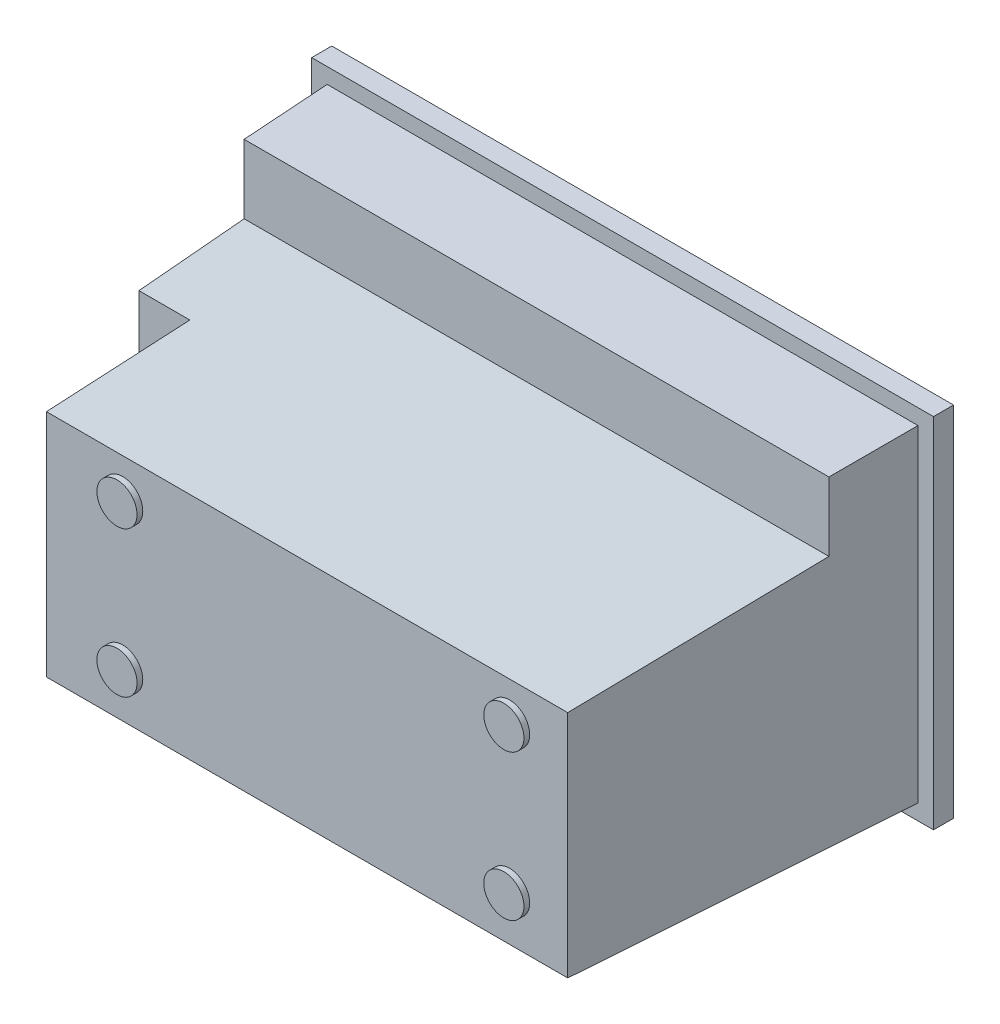
ISO-10303-21;
HEADER;
FILE_DESCRIPTION(('STEP AP214'),'2;1');
FILE_NAME('part.step','',(''),(''),'','','');
FILE_SCHEMA(('AUTOMOTIVE_DESIGN { 1 0 10303 214 1 1 1 1 }'));
ENDSEC;
DATA;
#1=APPLICATION_CONTEXT('core data for automotive mechanical design processes');
#2=APPLICATION_PROTOCOL_DEFINITION('international standard','automotive_design',2000,#1);
#3=PRODUCT_CONTEXT('',#1,'mechanical');
#4=PRODUCT('Part','Part','',(#3));
#5=PRODUCT_RELATED_PRODUCT_CATEGORY('part','',(#4));
#6=PRODUCT_DEFINITION_FORMATION('','',#4);
#7=PRODUCT_DEFINITION_CONTEXT('part definition',#1,'design');
#8=PRODUCT_DEFINITION('design','',#6,#7);
#9=PRODUCT_DEFINITION_SHAPE('','',#8);
#10=(LENGTH_UNIT() NAMED_UNIT(*) SI_UNIT(.MILLI.,.METRE.));
#11=(NAMED_UNIT(*) PLANE_ANGLE_UNIT() SI_UNIT($,.RADIAN.));
#12=(NAMED_UNIT(*) SI_UNIT($,.STERADIAN.) SOLID_ANGLE_UNIT());
#13=UNCERTAINTY_MEASURE_WITH_UNIT(LENGTH_MEASURE(1.E-05),#10,'distance_accuracy_value','');
#14=(GEOMETRIC_REPRESENTATION_CONTEXT(3) GLOBAL_UNCERTAINTY_ASSIGNED_CONTEXT((#13)) GLOBAL_UNIT_ASSIGNED_CONTEXT((#10,
#11,#12)) REPRESENTATION_CONTEXT('',''));
#15=CARTESIAN_POINT('',(0.,0.,0.));
#16=DIRECTION('',(0.,0.,1.));
#17=DIRECTION('',(1.,0.,0.));
#18=AXIS2_PLACEMENT_3D('',#15,#16,#17);
#19=CARTESIAN_POINT('',(-51.5,-28.5,59.));
#20=DIRECTION('',(0.,0.,1.));
#21=DIRECTION('',(1.,0.,0.));
#22=AXIS2_PLACEMENT_3D('',#19,#20,#21);
#23=PLANE('',#22);
#24=DIRECTION('',(1.,0.,0.));
#25=VECTOR('',#24,1.);
#26=CARTESIAN_POINT('',(-54.2,13.626611521418,59.));
#27=LINE('',#26,#25);
#28=CARTESIAN_POINT('',(-41.4396745999869,13.626611521418,59.));
#29=VERTEX_POINT('',#28);
#30=CARTESIAN_POINT('',(49.4396745999869,13.626611521418,59.));
#31=VERTEX_POINT('',#30);
#32=EDGE_CURVE('E179',#29,#31,#27,.T.);
#33=ORIENTED_EDGE('',*,*,#32,.F.);
#34=DIRECTION('',(0.,1.,0.));
#35=VECTOR('',#34,1.);
#36=CARTESIAN_POINT('',(-41.4396745999869,-28.5,59.));
#37=LINE('',#36,#35);
#38=CARTESIAN_POINT('',(-41.4396745999869,-26.4396745999869,59.));
#39=VERTEX_POINT('',#38);
#40=EDGE_CURVE('E279',#39,#29,#37,.T.);
#41=ORIENTED_EDGE('',*,*,#40,.F.);
#42=DIRECTION('',(-1.,0.,0.));
#43=VECTOR('',#42,1.);
#44=CARTESIAN_POINT('',(-51.5,-26.4396745999869,59.));
#45=LINE('',#44,#43);
#46=CARTESIAN_POINT('',(49.4396745999869,-26.4396745999869,59.));
#47=VERTEX_POINT('',#46);
#48=EDGE_CURVE('E275',#39,#47,#45,.F.);
#49=ORIENTED_EDGE('',*,*,#48,.T.);
#50=DIRECTION('',(0.,-1.,0.));
#51=VECTOR('',#50,1.);
#52=CARTESIAN_POINT('',(49.4396745999869,28.5,59.));
#53=LINE('',#52,#51);
#54=EDGE_CURVE('E284',#47,#31,#53,.F.);
#55=ORIENTED_EDGE('',*,*,#54,.T.);
#56=EDGE_LOOP('',(#33,#41,#49,#55));
#57=FACE_BOUND('',#56,.T.);
#58=CARTESIAN_POINT('',(-28.1462333825702,-18.4433528325343,59.));
#59=DIRECTION('',(0.,0.,1.));
#60=DIRECTION('',(1.,0.,0.));
#61=AXIS2_PLACEMENT_3D('',#58,#59,#60);
#62=CIRCLE('',#61,3.5);
#63=CARTESIAN_POINT('',(-24.6462333825702,-18.4433528325343,59.));
#64=VERTEX_POINT('',#63);
#65=EDGE_CURVE('E235',#64,#64,#62,.T.);
#66=ORIENTED_EDGE('',*,*,#65,.F.);
#67=EDGE_LOOP('',(#66));
#68=FACE_BOUND('',#67,.T.);
#69=CARTESIAN_POINT('',(-28.1462333825702,6.97733127127265,59.));
#70=DIRECTION('',(0.,0.,1.));
#71=DIRECTION('',(1.,0.,0.));
#72=AXIS2_PLACEMENT_3D('',#69,#70,#71);
#73=CIRCLE('',#72,3.5);
#74=CARTESIAN_POINT('',(-24.6462333825702,6.97733127127265,59.));
#75=VERTEX_POINT('',#74);
#76=EDGE_CURVE('E247',#75,#75,#73,.T.);
#77=ORIENTED_EDGE('',*,*,#76,.F.);
#78=EDGE_LOOP('',(#77));
#79=FACE_BOUND('',#78,.T.);
#80=CARTESIAN_POINT('',(39.3032988675529,6.97733127127265,59.));
#81=DIRECTION('',(0.,0.,1.));
#82=DIRECTION('',(1.,0.,0.));
#83=AXIS2_PLACEMENT_3D('',#80,#81,#82);
#84=CIRCLE('',#83,3.5);
#85=CARTESIAN_POINT('',(42.8032988675529,6.97733127127265,59.));
#86=VERTEX_POINT('',#85);
#87=EDGE_CURVE('E241',#86,#86,#84,.T.);
#88=ORIENTED_EDGE('',*,*,#87,.F.);
#89=EDGE_LOOP('',(#88));
#90=FACE_BOUND('',#89,.T.);
#91=CARTESIAN_POINT('',(39.3032988675529,-18.4433528325343,59.));
#92=DIRECTION('',(0.,0.,1.));
#93=DIRECTION('',(1.,0.,0.));
#94=AXIS2_PLACEMENT_3D('',#91,#92,#93);
#95=CIRCLE('',#94,3.5);
#96=CARTESIAN_POINT('',(42.8032988675529,-18.4433528325343,59.));
#97=VERTEX_POINT('',#96);
#98=EDGE_CURVE('E229',#97,#97,#95,.T.);
#99=ORIENTED_EDGE('',*,*,#98,.F.);
#100=EDGE_LOOP('',(#99));
#101=FACE_BOUND('',#100,.T.);
#102=ADVANCED_FACE('F28',(#57,#68,#79,#90,#101),#23,.T.);
#103=CARTESIAN_POINT('',(-51.5,28.5,0.));
#104=DIRECTION('',(-0.999390827019096,0.,0.034899496702501));
#105=DIRECTION('',(0.0348994967025011,0.,0.999390827019096));
#106=AXIS2_PLACEMENT_3D('',#103,#104,#105);
#107=PLANE('',#106);
#108=DIRECTION('',(0.034849905182522,-0.0532911128909333,0.99797071169229));
#109=VECTOR('',#108,1.);
#110=CARTESIAN_POINT('',(-51.5217715056825,16.8104727305136,-0.623454351076155));
#111=LINE('',#110,#109);
#112=CARTESIAN_POINT('',(-50.3126938372806,14.9615984169895,34.));
#113=VERTEX_POINT('',#112);
#114=CARTESIAN_POINT('',(-50.9761884576238,15.9761884576238,15.));
#115=VERTEX_POINT('',#114);
#116=EDGE_CURVE('E187',#113,#115,#111,.F.);
#117=ORIENTED_EDGE('',*,*,#116,.T.);
#118=DIRECTION('',(0.,-1.,0.));
#119=VECTOR('',#118,1.);
#120=CARTESIAN_POINT('',(-50.9761884576238,28.5,15.));
#121=LINE('',#120,#119);
#122=CARTESIAN_POINT('',(-50.9761884576238,27.9761884576238,15.));
#123=VERTEX_POINT('',#122);
#124=EDGE_CURVE('E196',#115,#123,#121,.F.);
#125=ORIENTED_EDGE('',*,*,#124,.T.);
#126=DIRECTION('',(-0.0348782627423747,0.0348782627423747,-0.998782765958718));
#127=VECTOR('',#126,1.);
#128=CARTESIAN_POINT('',(-51.5,28.5,0.));
#129=LINE('',#128,#127);
#130=CARTESIAN_POINT('',(-51.5,28.5,0.));
#131=VERTEX_POINT('',#130);
#132=EDGE_CURVE('E281',#123,#131,#129,.T.);
#133=ORIENTED_EDGE('',*,*,#132,.T.);
#134=DIRECTION('',(0.,-1.,0.));
#135=VECTOR('',#134,1.);
#136=CARTESIAN_POINT('',(-51.5,28.5,0.));
#137=LINE('',#136,#135);
#138=CARTESIAN_POINT('',(-51.5,-28.5,0.));
#139=VERTEX_POINT('',#138);
#140=EDGE_CURVE('E263',#131,#139,#137,.T.);
#141=ORIENTED_EDGE('',*,*,#140,.T.);
#142=DIRECTION('',(-0.0348782627423747,-0.0348782627423747,-0.998782765958718));
#143=VECTOR('',#142,1.);
#144=CARTESIAN_POINT('',(-51.5,-28.5,0.));
#145=LINE('',#144,#143);
#146=CARTESIAN_POINT('',(-50.3126938372806,-27.3126938372806,34.));
#147=VERTEX_POINT('',#146);
#148=EDGE_CURVE('E276',#147,#139,#145,.T.);
#149=ORIENTED_EDGE('',*,*,#148,.F.);
#150=DIRECTION('',(0.,1.,0.));
#151=VECTOR('',#150,1.);
#152=CARTESIAN_POINT('',(-50.3126938372806,28.5,34.));
#153=LINE('',#152,#151);
#154=EDGE_CURVE('E259',#113,#147,#153,.F.);
#155=ORIENTED_EDGE('',*,*,#154,.F.);
#156=EDGE_LOOP('',(#117,#125,#133,#141,#149,#155));
#157=FACE_BOUND('',#156,.T.);
#158=ADVANCED_FACE('F305',(#157),#107,.T.);
#159=CARTESIAN_POINT('',(-51.5,-28.5,0.));
#160=DIRECTION('',(0.,-0.999390827019096,0.034899496702501));
#161=DIRECTION('',(0.,-0.034899496702501,-0.999390827019096));
#162=AXIS2_PLACEMENT_3D('',#159,#160,#161);
#163=PLANE('',#162);
#164=ORIENTED_EDGE('',*,*,#48,.F.);
#165=DIRECTION('',(0.,0.034899496702501,0.999390827019096));
#166=VECTOR('',#165,1.);
#167=CARTESIAN_POINT('',(-41.4396745999869,-28.5,0.));
#168=LINE('',#167,#166);
#169=CARTESIAN_POINT('',(-41.4396745999869,-27.3126938372806,34.));
#170=VERTEX_POINT('',#169);
#171=EDGE_CURVE('E256',#39,#170,#168,.F.);
#172=ORIENTED_EDGE('',*,*,#171,.T.);
#173=DIRECTION('',(-1.,0.,0.));
#174=VECTOR('',#173,1.);
#175=CARTESIAN_POINT('',(-51.5,-27.3126938372806,34.));
#176=LINE('',#175,#174);
#177=EDGE_CURVE('E261',#147,#170,#176,.F.);
#178=ORIENTED_EDGE('',*,*,#177,.F.);
#179=ORIENTED_EDGE('',*,*,#148,.T.);
#180=DIRECTION('',(1.,0.,0.));
#181=VECTOR('',#180,1.);
#182=CARTESIAN_POINT('',(-51.5,-28.5,0.));
#183=LINE('',#182,#181);
#184=CARTESIAN_POINT('',(51.5,-28.5,0.));
#185=VERTEX_POINT('',#184);
#186=EDGE_CURVE('E266',#139,#185,#183,.T.);
#187=ORIENTED_EDGE('',*,*,#186,.T.);
#188=DIRECTION('',(0.0348782627423747,-0.0348782627423747,-0.998782765958718));
#189=VECTOR('',#188,1.);
#190=CARTESIAN_POINT('',(51.4306598869202,-28.4306598869202,1.98564104081884));
#191=LINE('',#190,#189);
#192=EDGE_CURVE('E280',#47,#185,#191,.T.);
#193=ORIENTED_EDGE('',*,*,#192,.F.);
#194=EDGE_LOOP('',(#164,#172,#178,#179,#187,#193));
#195=FACE_BOUND('',#194,.T.);
#196=ADVANCED_FACE('F30',(#195),#163,.T.);
#197=CARTESIAN_POINT('',(51.5,28.5,0.));
#198=DIRECTION('',(0.999390827019096,0.,0.034899496702501));
#199=DIRECTION('',(0.0348994967025011,0.,-0.999390827019096));
#200=AXIS2_PLACEMENT_3D('',#197,#198,#199);
#201=PLANE('',#200);
#202=DIRECTION('',(0.0348782627423747,0.0348782627423747,-0.998782765958718));
#203=VECTOR('',#202,1.);
#204=CARTESIAN_POINT('',(51.3747011991716,28.3747011991716,3.58808819656738));
#205=LINE('',#204,#203);
#206=CARTESIAN_POINT('',(50.9761884576238,27.9761884576238,15.));
#207=VERTEX_POINT('',#206);
#208=CARTESIAN_POINT('',(51.5,28.5,0.));
#209=VERTEX_POINT('',#208);
#210=EDGE_CURVE('E283',#207,#209,#205,.T.);
#211=ORIENTED_EDGE('',*,*,#210,.F.);
#212=DIRECTION('',(0.,1.,0.));
#213=VECTOR('',#212,1.);
#214=CARTESIAN_POINT('',(50.9761884576238,28.5,15.));
#215=LINE('',#214,#213);
#216=CARTESIAN_POINT('',(50.9761884576238,15.9761884576238,15.));
#217=VERTEX_POINT('',#216);
#218=EDGE_CURVE('E193',#207,#217,#215,.F.);
#219=ORIENTED_EDGE('',*,*,#218,.T.);
#220=DIRECTION('',(0.0348499051825219,0.0532911128909333,-0.99797071169229));
#221=VECTOR('',#220,1.);
#222=CARTESIAN_POINT('',(51.5217715056826,16.8104727305136,-0.623454351076155));
#223=LINE('',#222,#221);
#224=EDGE_CURVE('E190',#217,#31,#223,.F.);
#225=ORIENTED_EDGE('',*,*,#224,.T.);
#226=ORIENTED_EDGE('',*,*,#54,.F.);
#227=ORIENTED_EDGE('',*,*,#192,.T.);
#228=DIRECTION('',(0.,1.,0.));
#229=VECTOR('',#228,1.);
#230=CARTESIAN_POINT('',(51.5,28.5,0.));
#231=LINE('',#230,#229);
#232=EDGE_CURVE('E269',#185,#209,#231,.T.);
#233=ORIENTED_EDGE('',*,*,#232,.T.);
#234=EDGE_LOOP('',(#211,#219,#225,#226,#227,#233));
#235=FACE_BOUND('',#234,.T.);
#236=ADVANCED_FACE('F315',(#235),#201,.T.);
#237=CARTESIAN_POINT('',(-51.5,28.5,0.));
#238=DIRECTION('',(0.,0.999390827019096,0.034899496702501));
#239=DIRECTION('',(0.,-0.034899496702501,0.999390827019096));
#240=AXIS2_PLACEMENT_3D('',#237,#238,#239);
#241=PLANE('',#240);
#242=ORIENTED_EDGE('',*,*,#132,.F.);
#243=DIRECTION('',(-1.,0.,0.));
#244=VECTOR('',#243,1.);
#245=CARTESIAN_POINT('',(-51.5,27.9761884576238,15.));
#246=LINE('',#245,#244);
#247=EDGE_CURVE('E11',#123,#207,#246,.F.);
#248=ORIENTED_EDGE('',*,*,#247,.T.);
#249=ORIENTED_EDGE('',*,*,#210,.T.);
#250=DIRECTION('',(-1.,0.,0.));
#251=VECTOR('',#250,1.);
#252=CARTESIAN_POINT('',(-51.5,28.5,0.));
#253=LINE('',#252,#251);
#254=EDGE_CURVE('E272',#209,#131,#253,.T.);
#255=ORIENTED_EDGE('',*,*,#254,.T.);
#256=EDGE_LOOP('',(#242,#248,#249,#255));
#257=FACE_BOUND('',#256,.T.);
#258=ADVANCED_FACE('F312',(#257),#241,.T.);
#259=CARTESIAN_POINT('',(-80.979990109588,-38.0680697193499,34.));
#260=DIRECTION('',(0.,0.,1.));
#261=DIRECTION('',(1.,0.,0.));
#262=AXIS2_PLACEMENT_3D('',#259,#260,#261);
#263=PLANE('',#262);
#264=DIRECTION('',(1.,0.,0.));
#265=VECTOR('',#264,1.);
#266=CARTESIAN_POINT('',(-80.979990109588,14.9615984169895,34.));
#267=LINE('',#266,#265);
#268=CARTESIAN_POINT('',(-41.4396745999869,14.9615984169895,34.));
#269=VERTEX_POINT('',#268);
#270=EDGE_CURVE('E51',#113,#269,#267,.T.);
#271=ORIENTED_EDGE('',*,*,#270,.F.);
#272=ORIENTED_EDGE('',*,*,#154,.T.);
#273=ORIENTED_EDGE('',*,*,#177,.T.);
#274=DIRECTION('',(0.,1.,0.));
#275=VECTOR('',#274,1.);
#276=CARTESIAN_POINT('',(-41.4396745999869,46.4809028064995,34.));
#277=LINE('',#276,#275);
#278=EDGE_CURVE('E253',#170,#269,#277,.T.);
#279=ORIENTED_EDGE('',*,*,#278,.T.);
#280=EDGE_LOOP('',(#271,#272,#273,#279));
#281=FACE_BOUND('',#280,.T.);
#282=ADVANCED_FACE('F298',(#281),#263,.T.);
#283=CARTESIAN_POINT('',(-41.4396745999869,46.4809028064995,34.));
#284=DIRECTION('',(1.,0.,0.));
#285=DIRECTION('',(0.,1.,0.));
#286=AXIS2_PLACEMENT_3D('',#283,#284,#285);
#287=PLANE('',#286);
#288=ORIENTED_EDGE('',*,*,#40,.T.);
#289=DIRECTION('',(0.,0.053323503850156,-0.998577289916581));
#290=VECTOR('',#289,1.);
#291=CARTESIAN_POINT('',(-41.4396745999869,15.0512202829946,32.321671427966));
#292=LINE('',#291,#290);
#293=EDGE_CURVE('E36',#29,#269,#292,.T.);
#294=ORIENTED_EDGE('',*,*,#293,.T.);
#295=ORIENTED_EDGE('',*,*,#278,.F.);
#296=ORIENTED_EDGE('',*,*,#171,.F.);
#297=EDGE_LOOP('',(#288,#294,#295,#296));
#298=FACE_BOUND('',#297,.T.);
#299=ADVANCED_FACE('F294',(#298),#287,.F.);
#300=CARTESIAN_POINT('',(-28.1462333825702,6.97733127127265,60.));
#301=DIRECTION('',(0.,0.,-1.));
#302=DIRECTION('',(-1.,0.,0.));
#303=AXIS2_PLACEMENT_3D('',#300,#301,#302);
#304=CYLINDRICAL_SURFACE('',#303,3.5);
#305=CARTESIAN_POINT('',(-28.1462333825702,6.97733127127265,60.));
#306=DIRECTION('',(0.,0.,1.));
#307=DIRECTION('',(1.,0.,0.));
#308=AXIS2_PLACEMENT_3D('',#305,#306,#307);
#309=CIRCLE('',#308,3.5);
#310=CARTESIAN_POINT('',(-24.6462333825702,6.97733127127265,60.));
#311=VERTEX_POINT('',#310);
#312=EDGE_CURVE('E250',#311,#311,#309,.T.);
#313=ORIENTED_EDGE('',*,*,#312,.F.);
#314=EDGE_LOOP('',(#313));
#315=FACE_BOUND('',#314,.T.);
#316=ORIENTED_EDGE('',*,*,#76,.T.);
#317=EDGE_LOOP('',(#316));
#318=FACE_BOUND('',#317,.T.);
#319=ADVANCED_FACE('F467',(#315,#318),#304,.T.);
#320=CARTESIAN_POINT('',(-28.1462333825702,6.97733127127265,60.));
#321=DIRECTION('',(0.,0.,1.));
#322=DIRECTION('',(1.,0.,0.));
#323=AXIS2_PLACEMENT_3D('',#320,#321,#322);
#324=PLANE('',#323);
#325=ORIENTED_EDGE('',*,*,#312,.T.);
#326=EDGE_LOOP('',(#325));
#327=FACE_BOUND('',#326,.T.);
#328=ADVANCED_FACE('F463',(#327),#324,.T.);
#329=CARTESIAN_POINT('',(39.3032988675529,6.97733127127265,60.));
#330=DIRECTION('',(0.,0.,-1.));
#331=DIRECTION('',(-1.,0.,0.));
#332=AXIS2_PLACEMENT_3D('',#329,#330,#331);
#333=CYLINDRICAL_SURFACE('',#332,3.5);
#334=CARTESIAN_POINT('',(39.3032988675529,6.97733127127265,60.));
#335=DIRECTION('',(0.,0.,1.));
#336=DIRECTION('',(1.,0.,0.));
#337=AXIS2_PLACEMENT_3D('',#334,#335,#336);
#338=CIRCLE('',#337,3.5);
#339=CARTESIAN_POINT('',(42.8032988675529,6.97733127127265,60.));
#340=VERTEX_POINT('',#339);
#341=EDGE_CURVE('E244',#340,#340,#338,.T.);
#342=ORIENTED_EDGE('',*,*,#341,.F.);
#343=EDGE_LOOP('',(#342));
#344=FACE_BOUND('',#343,.T.);
#345=ORIENTED_EDGE('',*,*,#87,.T.);
#346=EDGE_LOOP('',(#345));
#347=FACE_BOUND('',#346,.T.);
#348=ADVANCED_FACE('F459',(#344,#347),#333,.T.);
#349=CARTESIAN_POINT('',(39.3032988675529,6.97733127127265,60.));
#350=DIRECTION('',(0.,0.,1.));
#351=DIRECTION('',(1.,0.,0.));
#352=AXIS2_PLACEMENT_3D('',#349,#350,#351);
#353=PLANE('',#352);
#354=ORIENTED_EDGE('',*,*,#341,.T.);
#355=EDGE_LOOP('',(#354));
#356=FACE_BOUND('',#355,.T.);
#357=ADVANCED_FACE('F455',(#356),#353,.T.);
#358=CARTESIAN_POINT('',(-28.1462333825702,-18.4433528325343,60.));
#359=DIRECTION('',(0.,0.,-1.));
#360=DIRECTION('',(-1.,0.,0.));
#361=AXIS2_PLACEMENT_3D('',#358,#359,#360);
#362=CYLINDRICAL_SURFACE('',#361,3.5);
#363=CARTESIAN_POINT('',(-28.1462333825702,-18.4433528325343,60.));
#364=DIRECTION('',(0.,0.,1.));
#365=DIRECTION('',(1.,0.,0.));
#366=AXIS2_PLACEMENT_3D('',#363,#364,#365);
#367=CIRCLE('',#366,3.5);
#368=CARTESIAN_POINT('',(-24.6462333825702,-18.4433528325343,60.));
#369=VERTEX_POINT('',#368);
#370=EDGE_CURVE('E238',#369,#369,#367,.T.);
#371=ORIENTED_EDGE('',*,*,#370,.F.);
#372=EDGE_LOOP('',(#371));
#373=FACE_BOUND('',#372,.T.);
#374=ORIENTED_EDGE('',*,*,#65,.T.);
#375=EDGE_LOOP('',(#374));
#376=FACE_BOUND('',#375,.T.);
#377=ADVANCED_FACE('F451',(#373,#376),#362,.T.);
#378=CARTESIAN_POINT('',(-28.1462333825702,-18.4433528325343,60.));
#379=DIRECTION('',(0.,0.,1.));
#380=DIRECTION('',(1.,0.,0.));
#381=AXIS2_PLACEMENT_3D('',#378,#379,#380);
#382=PLANE('',#381);
#383=ORIENTED_EDGE('',*,*,#370,.T.);
#384=EDGE_LOOP('',(#383));
#385=FACE_BOUND('',#384,.T.);
#386=ADVANCED_FACE('F447',(#385),#382,.T.);
#387=CARTESIAN_POINT('',(39.3032988675529,-18.4433528325343,60.));
#388=DIRECTION('',(0.,0.,-1.));
#389=DIRECTION('',(-1.,0.,0.));
#390=AXIS2_PLACEMENT_3D('',#387,#388,#389);
#391=CYLINDRICAL_SURFACE('',#390,3.5);
#392=CARTESIAN_POINT('',(39.3032988675529,-18.4433528325343,60.));
#393=DIRECTION('',(0.,0.,1.));
#394=DIRECTION('',(1.,0.,0.));
#395=AXIS2_PLACEMENT_3D('',#392,#393,#394);
#396=CIRCLE('',#395,3.5);
#397=CARTESIAN_POINT('',(42.8032988675529,-18.4433528325343,60.));
#398=VERTEX_POINT('',#397);
#399=EDGE_CURVE('E232',#398,#398,#396,.T.);
#400=ORIENTED_EDGE('',*,*,#399,.F.);
#401=EDGE_LOOP('',(#400));
#402=FACE_BOUND('',#401,.T.);
#403=ORIENTED_EDGE('',*,*,#98,.T.);
#404=EDGE_LOOP('',(#403));
#405=FACE_BOUND('',#404,.T.);
#406=ADVANCED_FACE('F444',(#402,#405),#391,.T.);
#407=CARTESIAN_POINT('',(39.3032988675529,-18.4433528325343,60.));
#408=DIRECTION('',(0.,0.,1.));
#409=DIRECTION('',(1.,0.,0.));
#410=AXIS2_PLACEMENT_3D('',#407,#408,#409);
#411=PLANE('',#410);
#412=ORIENTED_EDGE('',*,*,#399,.T.);
#413=EDGE_LOOP('',(#412));
#414=FACE_BOUND('',#413,.T.);
#415=ADVANCED_FACE('F357',(#414),#411,.T.);
#416=CARTESIAN_POINT('',(-54.2,-31.2,0.));
#417=DIRECTION('',(0.,0.,-1.));
#418=DIRECTION('',(-1.,0.,0.));
#419=AXIS2_PLACEMENT_3D('',#416,#417,#418);
#420=PLANE('',#419);
#421=DIRECTION('',(-1.,0.,0.));
#422=VECTOR('',#421,1.);
#423=CARTESIAN_POINT('',(54.2,-31.2,0.));
#424=LINE('',#423,#422);
#425=CARTESIAN_POINT('',(54.2,-31.2,0.));
#426=VERTEX_POINT('',#425);
#427=CARTESIAN_POINT('',(-54.2,-31.2,0.));
#428=VERTEX_POINT('',#427);
#429=EDGE_CURVE('E199',#426,#428,#424,.T.);
#430=ORIENTED_EDGE('',*,*,#429,.F.);
#431=DIRECTION('',(0.,-1.,0.));
#432=VECTOR('',#431,1.);
#433=CARTESIAN_POINT('',(54.2,31.2,0.));
#434=LINE('',#433,#432);
#435=CARTESIAN_POINT('',(54.2,31.2,0.));
#436=VERTEX_POINT('',#435);
#437=EDGE_CURVE('E206',#436,#426,#434,.T.);
#438=ORIENTED_EDGE('',*,*,#437,.F.);
#439=DIRECTION('',(1.,0.,0.));
#440=VECTOR('',#439,1.);
#441=CARTESIAN_POINT('',(-54.2,31.2,0.));
#442=LINE('',#441,#440);
#443=CARTESIAN_POINT('',(-54.2,31.2,0.));
#444=VERTEX_POINT('',#443);
#445=EDGE_CURVE('E204',#444,#436,#442,.T.);
#446=ORIENTED_EDGE('',*,*,#445,.F.);
#447=DIRECTION('',(0.,1.,0.));
#448=VECTOR('',#447,1.);
#449=CARTESIAN_POINT('',(-54.2,-31.2,0.));
#450=LINE('',#449,#448);
#451=EDGE_CURVE('E202',#428,#444,#450,.T.);
#452=ORIENTED_EDGE('',*,*,#451,.F.);
#453=EDGE_LOOP('',(#430,#438,#446,#452));
#454=FACE_BOUND('',#453,.T.);
#455=ORIENTED_EDGE('',*,*,#186,.F.);
#456=ORIENTED_EDGE('',*,*,#140,.F.);
#457=ORIENTED_EDGE('',*,*,#254,.F.);
#458=ORIENTED_EDGE('',*,*,#232,.F.);
#459=EDGE_LOOP('',(#455,#456,#457,#458));
#460=FACE_BOUND('',#459,.T.);
#461=ADVANCED_FACE('F310',(#454,#460),#420,.F.);
#462=CARTESIAN_POINT('',(54.2,-31.2,-3.5));
#463=DIRECTION('',(0.,1.,0.));
#464=DIRECTION('',(-1.,0.,0.));
#465=AXIS2_PLACEMENT_3D('',#462,#463,#464);
#466=PLANE('',#465);
#467=ORIENTED_EDGE('',*,*,#429,.T.);
#468=DIRECTION('',(0.,0.,1.));
#469=VECTOR('',#468,1.);
#470=CARTESIAN_POINT('',(-54.2,-31.2,-3.5));
#471=LINE('',#470,#469);
#472=CARTESIAN_POINT('',(-54.2,-31.2,-3.5));
#473=VERTEX_POINT('',#472);
#474=EDGE_CURVE('E226',#473,#428,#471,.T.);
#475=ORIENTED_EDGE('',*,*,#474,.F.);
#476=DIRECTION('',(-1.,0.,0.));
#477=VECTOR('',#476,1.);
#478=CARTESIAN_POINT('',(54.2,-31.2,-3.5));
#479=LINE('',#478,#477);
#480=CARTESIAN_POINT('',(54.2,-31.2,-3.5));
#481=VERTEX_POINT('',#480);
#482=EDGE_CURVE('E208',#481,#473,#479,.T.);
#483=ORIENTED_EDGE('',*,*,#482,.F.);
#484=DIRECTION('',(0.,0.,1.));
#485=VECTOR('',#484,1.);
#486=CARTESIAN_POINT('',(54.2,-31.2,-3.5));
#487=LINE('',#486,#485);
#488=EDGE_CURVE('E217',#481,#426,#487,.T.);
#489=ORIENTED_EDGE('',*,*,#488,.T.);
#490=EDGE_LOOP('',(#467,#475,#483,#489));
#491=FACE_BOUND('',#490,.T.);
#492=ADVANCED_FACE('F364',(#491),#466,.F.);
#493=CARTESIAN_POINT('',(-54.2,-31.2,-3.5));
#494=DIRECTION('',(1.,0.,0.));
#495=DIRECTION('',(0.,1.,0.));
#496=AXIS2_PLACEMENT_3D('',#493,#494,#495);
#497=PLANE('',#496);
#498=ORIENTED_EDGE('',*,*,#451,.T.);
#499=DIRECTION('',(0.,0.,1.));
#500=VECTOR('',#499,1.);
#501=CARTESIAN_POINT('',(-54.2,31.2,-3.5));
#502=LINE('',#501,#500);
#503=CARTESIAN_POINT('',(-54.2,31.2,-3.5));
#504=VERTEX_POINT('',#503);
#505=EDGE_CURVE('E223',#504,#444,#502,.T.);
#506=ORIENTED_EDGE('',*,*,#505,.F.);
#507=DIRECTION('',(0.,1.,0.));
#508=VECTOR('',#507,1.);
#509=CARTESIAN_POINT('',(-54.2,-31.2,-3.5));
#510=LINE('',#509,#508);
#511=EDGE_CURVE('E211',#473,#504,#510,.T.);
#512=ORIENTED_EDGE('',*,*,#511,.F.);
#513=ORIENTED_EDGE('',*,*,#474,.T.);
#514=EDGE_LOOP('',(#498,#506,#512,#513));
#515=FACE_BOUND('',#514,.T.);
#516=ADVANCED_FACE('F372',(#515),#497,.F.);
#517=CARTESIAN_POINT('',(-54.2,31.2,-3.5));
#518=DIRECTION('',(0.,-1.,0.));
#519=DIRECTION('',(1.,0.,0.));
#520=AXIS2_PLACEMENT_3D('',#517,#518,#519);
#521=PLANE('',#520);
#522=ORIENTED_EDGE('',*,*,#445,.T.);
#523=DIRECTION('',(0.,0.,1.));
#524=VECTOR('',#523,1.);
#525=CARTESIAN_POINT('',(54.2,31.2,-3.5));
#526=LINE('',#525,#524);
#527=CARTESIAN_POINT('',(54.2,31.2,-3.5));
#528=VERTEX_POINT('',#527);
#529=EDGE_CURVE('E220',#528,#436,#526,.T.);
#530=ORIENTED_EDGE('',*,*,#529,.F.);
#531=DIRECTION('',(1.,0.,0.));
#532=VECTOR('',#531,1.);
#533=CARTESIAN_POINT('',(-54.2,31.2,-3.5));
#534=LINE('',#533,#532);
#535=EDGE_CURVE('E213',#504,#528,#534,.T.);
#536=ORIENTED_EDGE('',*,*,#535,.F.);
#537=ORIENTED_EDGE('',*,*,#505,.T.);
#538=EDGE_LOOP('',(#522,#530,#536,#537));
#539=FACE_BOUND('',#538,.T.);
#540=ADVANCED_FACE('F380',(#539),#521,.F.);
#541=CARTESIAN_POINT('',(54.2,31.2,-3.5));
#542=DIRECTION('',(-1.,0.,0.));
#543=DIRECTION('',(0.,-1.,0.));
#544=AXIS2_PLACEMENT_3D('',#541,#542,#543);
#545=PLANE('',#544);
#546=ORIENTED_EDGE('',*,*,#437,.T.);
#547=ORIENTED_EDGE('',*,*,#488,.F.);
#548=DIRECTION('',(0.,-1.,0.));
#549=VECTOR('',#548,1.);
#550=CARTESIAN_POINT('',(54.2,31.2,-3.5));
#551=LINE('',#550,#549);
#552=EDGE_CURVE('E215',#528,#481,#551,.T.);
#553=ORIENTED_EDGE('',*,*,#552,.F.);
#554=ORIENTED_EDGE('',*,*,#529,.T.);
#555=EDGE_LOOP('',(#546,#547,#553,#554));
#556=FACE_BOUND('',#555,.T.);
#557=ADVANCED_FACE('F333',(#556),#545,.F.);
#558=CARTESIAN_POINT('',(-54.2,-31.2,-3.5));
#559=DIRECTION('',(0.,0.,-1.));
#560=DIRECTION('',(-1.,0.,0.));
#561=AXIS2_PLACEMENT_3D('',#558,#559,#560);
#562=PLANE('',#561);
#563=DIRECTION('',(0.,-1.,0.));
#564=VECTOR('',#563,1.);
#565=CARTESIAN_POINT('',(46.1674052191039,-9.87395371738038,-3.5));
#566=LINE('',#565,#564);
#567=CARTESIAN_POINT('',(46.1674052191039,-9.87395371738038,-3.5));
#568=VERTEX_POINT('',#567);
#569=CARTESIAN_POINT('',(46.1674052191039,-24.9962251764317,-3.5));
#570=VERTEX_POINT('',#569);
#571=EDGE_CURVE('E43',#568,#570,#566,.T.);
#572=ORIENTED_EDGE('',*,*,#571,.F.);
#573=DIRECTION('',(1.,0.,0.));
#574=VECTOR('',#573,1.);
#575=CARTESIAN_POINT('',(46.1674052191039,-9.87395371738038,-3.5));
#576=LINE('',#575,#574);
#577=CARTESIAN_POINT('',(-43.1429509272936,-9.87395371738038,-3.5));
#578=VERTEX_POINT('',#577);
#579=EDGE_CURVE('E163',#578,#568,#576,.T.);
#580=ORIENTED_EDGE('',*,*,#579,.F.);
#581=DIRECTION('',(0.,1.,0.));
#582=VECTOR('',#581,1.);
#583=CARTESIAN_POINT('',(-43.1429509272936,-9.87395371738038,-3.5));
#584=LINE('',#583,#582);
#585=CARTESIAN_POINT('',(-43.1429509272936,-24.9962251764317,-3.5));
#586=VERTEX_POINT('',#585);
#587=EDGE_CURVE('E145',#586,#578,#584,.T.);
#588=ORIENTED_EDGE('',*,*,#587,.F.);
#589=DIRECTION('',(-1.,0.,0.));
#590=VECTOR('',#589,1.);
#591=CARTESIAN_POINT('',(46.1674052191039,-24.9962251764317,-3.5));
#592=LINE('',#591,#590);
#593=EDGE_CURVE('E156',#570,#586,#592,.T.);
#594=ORIENTED_EDGE('',*,*,#593,.F.);
#595=EDGE_LOOP('',(#572,#580,#588,#594));
#596=FACE_BOUND('',#595,.T.);
#597=ORIENTED_EDGE('',*,*,#482,.T.);
#598=ORIENTED_EDGE('',*,*,#511,.T.);
#599=ORIENTED_EDGE('',*,*,#535,.T.);
#600=ORIENTED_EDGE('',*,*,#552,.T.);
#601=EDGE_LOOP('',(#597,#598,#599,#600));
#602=FACE_BOUND('',#601,.T.);
#603=ADVANCED_FACE('F160',(#596,#602),#562,.T.);
#604=CARTESIAN_POINT('',(-54.2,15.9761884576238,15.));
#605=DIRECTION('',(0.,0.,-1.));
#606=DIRECTION('',(-1.,0.,0.));
#607=AXIS2_PLACEMENT_3D('',#604,#605,#606);
#608=PLANE('',#607);
#609=DIRECTION('',(1.,0.,0.));
#610=VECTOR('',#609,1.);
#611=CARTESIAN_POINT('',(-54.2,15.9761884576238,15.));
#612=LINE('',#611,#610);
#613=EDGE_CURVE('E182',#115,#217,#612,.T.);
#614=ORIENTED_EDGE('',*,*,#613,.T.);
#615=ORIENTED_EDGE('',*,*,#218,.F.);
#616=ORIENTED_EDGE('',*,*,#247,.F.);
#617=ORIENTED_EDGE('',*,*,#124,.F.);
#618=EDGE_LOOP('',(#614,#615,#616,#617));
#619=FACE_BOUND('',#618,.T.);
#620=ADVANCED_FACE('F323',(#619),#608,.F.);
#621=CARTESIAN_POINT('',(-54.2,13.626611521418,59.));
#622=DIRECTION('',(0.,-0.99857728991658,-0.053323503850156));
#623=DIRECTION('',(0.,0.053323503850156,-0.998577289916581));
#624=AXIS2_PLACEMENT_3D('',#621,#622,#623);
#625=PLANE('',#624);
#626=ORIENTED_EDGE('',*,*,#613,.F.);
#627=ORIENTED_EDGE('',*,*,#116,.F.);
#628=ORIENTED_EDGE('',*,*,#270,.T.);
#629=ORIENTED_EDGE('',*,*,#293,.F.);
#630=ORIENTED_EDGE('',*,*,#32,.T.);
#631=ORIENTED_EDGE('',*,*,#224,.F.);
#632=EDGE_LOOP('',(#626,#627,#628,#629,#630,#631));
#633=FACE_BOUND('',#632,.T.);
#634=ADVANCED_FACE('F321',(#633),#625,.F.);
#635=CARTESIAN_POINT('',(46.1674052191039,-9.87395371738038,-3.));
#636=DIRECTION('',(1.,0.,0.));
#637=DIRECTION('',(0.,0.,-1.));
#638=AXIS2_PLACEMENT_3D('',#635,#636,#637);
#639=PLANE('',#638);
#640=ORIENTED_EDGE('',*,*,#571,.T.);
#641=DIRECTION('',(0.,0.,-1.));
#642=VECTOR('',#641,1.);
#643=CARTESIAN_POINT('',(46.1674052191039,-24.9962251764317,-3.));
#644=LINE('',#643,#642);
#645=CARTESIAN_POINT('',(46.1674052191039,-24.9962251764317,-3.));
#646=VERTEX_POINT('',#645);
#647=EDGE_CURVE('E153',#646,#570,#644,.T.);
#648=ORIENTED_EDGE('',*,*,#647,.F.);
#649=DIRECTION('',(0.,-1.,0.));
#650=VECTOR('',#649,1.);
#651=CARTESIAN_POINT('',(46.1674052191039,-9.87395371738038,-3.));
#652=LINE('',#651,#650);
#653=CARTESIAN_POINT('',(46.1674052191039,-9.87395371738038,-3.));
#654=VERTEX_POINT('',#653);
#655=EDGE_CURVE('E165',#654,#646,#652,.T.);
#656=ORIENTED_EDGE('',*,*,#655,.F.);
#657=DIRECTION('',(0.,0.,-1.));
#658=VECTOR('',#657,1.);
#659=CARTESIAN_POINT('',(46.1674052191039,-9.87395371738038,-3.));
#660=LINE('',#659,#658);
#661=EDGE_CURVE('E177',#654,#568,#660,.T.);
#662=ORIENTED_EDGE('',*,*,#661,.T.);
#663=EDGE_LOOP('',(#640,#648,#656,#662));
#664=FACE_BOUND('',#663,.T.);
#665=ADVANCED_FACE('F330',(#664),#639,.F.);
#666=CARTESIAN_POINT('',(46.1674052191039,-9.87395371738038,-3.));
#667=DIRECTION('',(0.,1.,0.));
#668=DIRECTION('',(0.,0.,1.));
#669=AXIS2_PLACEMENT_3D('',#666,#667,#668);
#670=PLANE('',#669);
#671=ORIENTED_EDGE('',*,*,#579,.T.);
#672=ORIENTED_EDGE('',*,*,#661,.F.);
#673=DIRECTION('',(1.,0.,0.));
#674=VECTOR('',#673,1.);
#675=CARTESIAN_POINT('',(46.1674052191039,-9.87395371738038,-3.));
#676=LINE('',#675,#674);
#677=CARTESIAN_POINT('',(-43.1429509272936,-9.87395371738038,-3.));
#678=VERTEX_POINT('',#677);
#679=EDGE_CURVE('E174',#678,#654,#676,.T.);
#680=ORIENTED_EDGE('',*,*,#679,.F.);
#681=DIRECTION('',(0.,0.,-1.));
#682=VECTOR('',#681,1.);
#683=CARTESIAN_POINT('',(-43.1429509272936,-9.87395371738038,-3.));
#684=LINE('',#683,#682);
#685=EDGE_CURVE('E152',#678,#578,#684,.T.);
#686=ORIENTED_EDGE('',*,*,#685,.T.);
#687=EDGE_LOOP('',(#671,#672,#680,#686));
#688=FACE_BOUND('',#687,.T.);
#689=ADVANCED_FACE('F412',(#688),#670,.F.);
#690=CARTESIAN_POINT('',(-43.1429509272936,-9.87395371738038,-3.));
#691=DIRECTION('',(-1.,0.,0.));
#692=DIRECTION('',(0.,0.,1.));
#693=AXIS2_PLACEMENT_3D('',#690,#691,#692);
#694=PLANE('',#693);
#695=ORIENTED_EDGE('',*,*,#587,.T.);
#696=ORIENTED_EDGE('',*,*,#685,.F.);
#697=DIRECTION('',(0.,1.,0.));
#698=VECTOR('',#697,1.);
#699=CARTESIAN_POINT('',(-43.1429509272936,-9.87395371738038,-3.));
#700=LINE('',#699,#698);
#701=CARTESIAN_POINT('',(-43.1429509272936,-24.9962251764317,-3.));
#702=VERTEX_POINT('',#701);
#703=EDGE_CURVE('E148',#702,#678,#700,.T.);
#704=ORIENTED_EDGE('',*,*,#703,.F.);
#705=DIRECTION('',(0.,0.,-1.));
#706=VECTOR('',#705,1.);
#707=CARTESIAN_POINT('',(-43.1429509272936,-24.9962251764317,-3.));
#708=LINE('',#707,#706);
#709=EDGE_CURVE('E141',#702,#586,#708,.T.);
#710=ORIENTED_EDGE('',*,*,#709,.T.);
#711=EDGE_LOOP('',(#695,#696,#704,#710));
#712=FACE_BOUND('',#711,.T.);
#713=ADVANCED_FACE('F143',(#712),#694,.F.);
#714=CARTESIAN_POINT('',(46.1674052191039,-24.9962251764317,-3.));
#715=DIRECTION('',(0.,-1.,0.));
#716=DIRECTION('',(0.,0.,-1.));
#717=AXIS2_PLACEMENT_3D('',#714,#715,#716);
#718=PLANE('',#717);
#719=ORIENTED_EDGE('',*,*,#593,.T.);
#720=ORIENTED_EDGE('',*,*,#709,.F.);
#721=DIRECTION('',(-1.,0.,0.));
#722=VECTOR('',#721,1.);
#723=CARTESIAN_POINT('',(46.1674052191039,-24.9962251764317,-3.));
#724=LINE('',#723,#722);
#725=EDGE_CURVE('E171',#646,#702,#724,.T.);
#726=ORIENTED_EDGE('',*,*,#725,.F.);
#727=ORIENTED_EDGE('',*,*,#647,.T.);
#728=EDGE_LOOP('',(#719,#720,#726,#727));
#729=FACE_BOUND('',#728,.T.);
#730=ADVANCED_FACE('F157',(#729),#718,.F.);
#731=CARTESIAN_POINT('',(46.1674052191039,-24.9962251764317,-3.));
#732=DIRECTION('',(0.,0.,-1.));
#733=DIRECTION('',(-1.,0.,0.));
#734=AXIS2_PLACEMENT_3D('',#731,#732,#733);
#735=PLANE('',#734);
#736=ORIENTED_EDGE('',*,*,#655,.T.);
#737=ORIENTED_EDGE('',*,*,#725,.T.);
#738=ORIENTED_EDGE('',*,*,#703,.T.);
#739=ORIENTED_EDGE('',*,*,#679,.T.);
#740=EDGE_LOOP('',(#736,#737,#738,#739));
#741=FACE_BOUND('',#740,.T.);
#742=ADVANCED_FACE('F431',(#741),#735,.T.);
#743=CLOSED_SHELL('',(#102,#158,#196,#236,#258,#282,#299,#319,#328,#348,#357,#377,#386,#406,
#415,#461,#492,#516,#540,#557,#603,#620,#634,#665,#689,#713,#730,#742));
#744=MANIFOLD_SOLID_BREP('B2',#743);
#745=ADVANCED_BREP_SHAPE_REPRESENTATION('',(#18,#744),#14);
#746=SHAPE_DEFINITION_REPRESENTATION(#9,#745);
ENDSEC;
END-ISO-10303-21;
